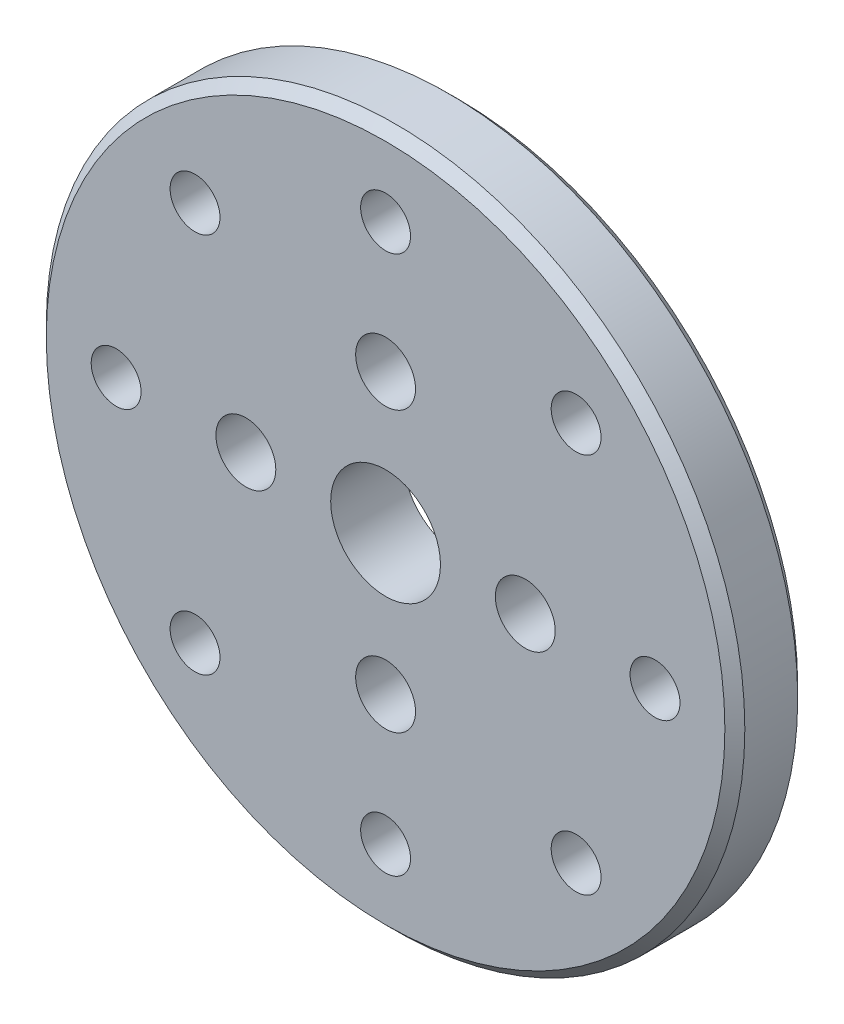
ISO-10303-21;
HEADER;
FILE_DESCRIPTION(('STEP AP214'),'2;1');
FILE_NAME('part.step','',(''),(''),'','','');
FILE_SCHEMA(('AUTOMOTIVE_DESIGN { 1 0 10303 214 1 1 1 1 }'));
ENDSEC;
DATA;
#1=APPLICATION_CONTEXT('core data for automotive mechanical design processes');
#2=APPLICATION_PROTOCOL_DEFINITION('international standard','automotive_design',2000,#1);
#3=PRODUCT_CONTEXT('',#1,'mechanical');
#4=PRODUCT('Part','Part','',(#3));
#5=PRODUCT_RELATED_PRODUCT_CATEGORY('part','',(#4));
#6=PRODUCT_DEFINITION_FORMATION('','',#4);
#7=PRODUCT_DEFINITION_CONTEXT('part definition',#1,'design');
#8=PRODUCT_DEFINITION('design','',#6,#7);
#9=PRODUCT_DEFINITION_SHAPE('','',#8);
#10=(LENGTH_UNIT() NAMED_UNIT(*) SI_UNIT(.MILLI.,.METRE.));
#11=(NAMED_UNIT(*) PLANE_ANGLE_UNIT() SI_UNIT($,.RADIAN.));
#12=(NAMED_UNIT(*) SI_UNIT($,.STERADIAN.) SOLID_ANGLE_UNIT());
#13=UNCERTAINTY_MEASURE_WITH_UNIT(LENGTH_MEASURE(1.E-05),#10,'distance_accuracy_value','');
#14=(GEOMETRIC_REPRESENTATION_CONTEXT(3) GLOBAL_UNCERTAINTY_ASSIGNED_CONTEXT((#13)) GLOBAL_UNIT_ASSIGNED_CONTEXT((#10,
#11,#12)) REPRESENTATION_CONTEXT('',''));
#15=CARTESIAN_POINT('',(0.,0.,0.));
#16=DIRECTION('',(0.,0.,1.));
#17=DIRECTION('',(1.,0.,0.));
#18=AXIS2_PLACEMENT_3D('',#15,#16,#17);
#19=CARTESIAN_POINT('',(0.,0.,3.65));
#20=DIRECTION('',(0.,0.,-1.));
#21=DIRECTION('',(-1.,0.,0.));
#22=AXIS2_PLACEMENT_3D('',#19,#20,#21);
#23=CYLINDRICAL_SURFACE('',#22,17.5);
#24=CARTESIAN_POINT('',(0.,0.,0.500000000000007));
#25=DIRECTION('',(0.,0.,1.));
#26=DIRECTION('',(1.,0.,0.));
#27=AXIS2_PLACEMENT_3D('',#24,#25,#26);
#28=CIRCLE('',#27,17.5);
#29=CARTESIAN_POINT('',(17.5,0.,0.500000000000007));
#30=VERTEX_POINT('',#29);
#31=EDGE_CURVE('E57',#30,#30,#28,.T.);
#32=ORIENTED_EDGE('',*,*,#31,.T.);
#33=EDGE_LOOP('',(#32));
#34=FACE_BOUND('',#33,.T.);
#35=CARTESIAN_POINT('',(0.,0.,3.15));
#36=DIRECTION('',(0.,0.,1.));
#37=DIRECTION('',(1.,0.,0.));
#38=AXIS2_PLACEMENT_3D('',#35,#36,#37);
#39=CIRCLE('',#38,17.5);
#40=CARTESIAN_POINT('',(17.5,0.,3.15));
#41=VERTEX_POINT('',#40);
#42=EDGE_CURVE('E63',#41,#41,#39,.F.);
#43=ORIENTED_EDGE('',*,*,#42,.T.);
#44=EDGE_LOOP('',(#43));
#45=FACE_BOUND('',#44,.T.);
#46=ADVANCED_FACE('F42',(#34,#45),#23,.T.);
#47=CARTESIAN_POINT('',(0.,0.,3.65));
#48=DIRECTION('',(0.,0.,1.));
#49=DIRECTION('',(1.,0.,0.));
#50=AXIS2_PLACEMENT_3D('',#47,#48,#49);
#51=PLANE('',#50);
#52=CARTESIAN_POINT('',(0.,0.,3.65));
#53=DIRECTION('',(0.,0.,1.));
#54=DIRECTION('',(1.,0.,0.));
#55=AXIS2_PLACEMENT_3D('',#52,#53,#54);
#56=CIRCLE('',#55,2.75);
#57=CARTESIAN_POINT('',(2.75,0.,3.65));
#58=VERTEX_POINT('',#57);
#59=EDGE_CURVE('E155',#58,#58,#56,.T.);
#60=ORIENTED_EDGE('',*,*,#59,.F.);
#61=EDGE_LOOP('',(#60));
#62=FACE_BOUND('',#61,.T.);
#63=CARTESIAN_POINT('',(0.,7.,3.65));
#64=DIRECTION('',(0.,0.,1.));
#65=DIRECTION('',(1.,0.,0.));
#66=AXIS2_PLACEMENT_3D('',#63,#64,#65);
#67=CIRCLE('',#66,1.5);
#68=CARTESIAN_POINT('',(1.5,7.,3.65));
#69=VERTEX_POINT('',#68);
#70=EDGE_CURVE('E107',#69,#69,#67,.T.);
#71=ORIENTED_EDGE('',*,*,#70,.F.);
#72=EDGE_LOOP('',(#71));
#73=FACE_BOUND('',#72,.T.);
#74=CARTESIAN_POINT('',(-7.0000000000002,1.97666086873723E-13,3.65));
#75=DIRECTION('',(0.,0.,1.));
#76=DIRECTION('',(1.,0.,0.));
#77=AXIS2_PLACEMENT_3D('',#74,#75,#76);
#78=CIRCLE('',#77,1.50000000000015);
#79=CARTESIAN_POINT('',(-5.50000000000004,1.97666086873723E-13,3.65));
#80=VERTEX_POINT('',#79);
#81=EDGE_CURVE('E137',#80,#80,#78,.T.);
#82=ORIENTED_EDGE('',*,*,#81,.F.);
#83=EDGE_LOOP('',(#82));
#84=FACE_BOUND('',#83,.T.);
#85=CARTESIAN_POINT('',(-3.95332173747447E-13,-7.,3.65));
#86=DIRECTION('',(0.,0.,1.));
#87=DIRECTION('',(1.,0.,0.));
#88=AXIS2_PLACEMENT_3D('',#85,#86,#87);
#89=CIRCLE('',#88,1.50000000000042);
#90=CARTESIAN_POINT('',(1.50000000000003,-7.,3.65));
#91=VERTEX_POINT('',#90);
#92=EDGE_CURVE('E141',#91,#91,#89,.T.);
#93=ORIENTED_EDGE('',*,*,#92,.F.);
#94=EDGE_LOOP('',(#93));
#95=FACE_BOUND('',#94,.T.);
#96=CARTESIAN_POINT('',(6.9999999999998,-1.98523339633126E-13,3.65));
#97=DIRECTION('',(0.,0.,1.));
#98=DIRECTION('',(1.,0.,0.));
#99=AXIS2_PLACEMENT_3D('',#96,#97,#98);
#100=CIRCLE('',#99,1.50000000000032);
#101=CARTESIAN_POINT('',(8.50000000000012,-1.98523339633126E-13,3.65));
#102=VERTEX_POINT('',#101);
#103=EDGE_CURVE('E145',#102,#102,#100,.T.);
#104=ORIENTED_EDGE('',*,*,#103,.F.);
#105=EDGE_LOOP('',(#104));
#106=FACE_BOUND('',#105,.T.);
#107=CARTESIAN_POINT('',(0.,0.,3.65));
#108=DIRECTION('',(0.,0.,1.));
#109=DIRECTION('',(1.,0.,0.));
#110=AXIS2_PLACEMENT_3D('',#107,#108,#109);
#111=CIRCLE('',#110,17.);
#112=CARTESIAN_POINT('',(17.,0.,3.65));
#113=VERTEX_POINT('',#112);
#114=EDGE_CURVE('E10',#113,#113,#111,.T.);
#115=ORIENTED_EDGE('',*,*,#114,.T.);
#116=EDGE_LOOP('',(#115));
#117=FACE_BOUND('',#116,.T.);
#118=CARTESIAN_POINT('',(0.,13.5,3.65));
#119=DIRECTION('',(0.,0.,1.));
#120=DIRECTION('',(1.,0.,0.));
#121=AXIS2_PLACEMENT_3D('',#118,#119,#120);
#122=CIRCLE('',#121,1.25);
#123=CARTESIAN_POINT('',(1.25,13.5,3.65));
#124=VERTEX_POINT('',#123);
#125=EDGE_CURVE('E69',#124,#124,#122,.T.);
#126=ORIENTED_EDGE('',*,*,#125,.F.);
#127=EDGE_LOOP('',(#126));
#128=FACE_BOUND('',#127,.T.);
#129=CARTESIAN_POINT('',(-9.54594154601854,9.54594154601875,3.65));
#130=DIRECTION('',(0.,0.,1.));
#131=DIRECTION('',(1.,0.,0.));
#132=AXIS2_PLACEMENT_3D('',#129,#130,#131);
#133=CIRCLE('',#132,1.25);
#134=CARTESIAN_POINT('',(-8.29594154601854,9.54594154601875,3.65));
#135=VERTEX_POINT('',#134);
#136=EDGE_CURVE('E73',#135,#135,#133,.T.);
#137=ORIENTED_EDGE('',*,*,#136,.F.);
#138=EDGE_LOOP('',(#137));
#139=FACE_BOUND('',#138,.T.);
#140=CARTESIAN_POINT('',(-13.5000000000005,5.09478254018743E-13,3.65));
#141=DIRECTION('',(0.,0.,1.));
#142=DIRECTION('',(1.,0.,0.));
#143=AXIS2_PLACEMENT_3D('',#140,#141,#142);
#144=CIRCLE('',#143,1.25);
#145=CARTESIAN_POINT('',(-12.2500000000005,5.09478254018743E-13,3.65));
#146=VERTEX_POINT('',#145);
#147=EDGE_CURVE('E77',#146,#146,#144,.T.);
#148=ORIENTED_EDGE('',*,*,#147,.F.);
#149=EDGE_LOOP('',(#148));
#150=FACE_BOUND('',#149,.T.);
#151=CARTESIAN_POINT('',(-9.54594154601926,-9.54594154601803,3.65));
#152=DIRECTION('',(0.,0.,1.));
#153=DIRECTION('',(1.,0.,0.));
#154=AXIS2_PLACEMENT_3D('',#151,#152,#153);
#155=CIRCLE('',#154,1.25);
#156=CARTESIAN_POINT('',(-8.29594154601926,-9.54594154601803,3.65));
#157=VERTEX_POINT('',#156);
#158=EDGE_CURVE('E81',#157,#157,#155,.T.);
#159=ORIENTED_EDGE('',*,*,#158,.F.);
#160=EDGE_LOOP('',(#159));
#161=FACE_BOUND('',#160,.T.);
#162=CARTESIAN_POINT('',(-1.01895650803749E-12,-13.5,3.65));
#163=DIRECTION('',(0.,0.,1.));
#164=DIRECTION('',(1.,0.,0.));
#165=AXIS2_PLACEMENT_3D('',#162,#163,#164);
#166=CIRCLE('',#165,1.25);
#167=CARTESIAN_POINT('',(1.24999999999898,-13.5,3.65));
#168=VERTEX_POINT('',#167);
#169=EDGE_CURVE('E85',#168,#168,#166,.T.);
#170=ORIENTED_EDGE('',*,*,#169,.F.);
#171=EDGE_LOOP('',(#170));
#172=FACE_BOUND('',#171,.T.);
#173=CARTESIAN_POINT('',(9.54594154601752,-9.54594154601875,3.65));
#174=DIRECTION('',(0.,0.,1.));
#175=DIRECTION('',(1.,0.,0.));
#176=AXIS2_PLACEMENT_3D('',#173,#174,#175);
#177=CIRCLE('',#176,1.25);
#178=CARTESIAN_POINT('',(10.7959415460175,-9.54594154601875,3.65));
#179=VERTEX_POINT('',#178);
#180=EDGE_CURVE('E89',#179,#179,#177,.T.);
#181=ORIENTED_EDGE('',*,*,#180,.F.);
#182=EDGE_LOOP('',(#181));
#183=FACE_BOUND('',#182,.T.);
#184=CARTESIAN_POINT('',(13.4999999999995,-5.11131527197592E-13,3.65));
#185=DIRECTION('',(0.,0.,1.));
#186=DIRECTION('',(1.,0.,0.));
#187=AXIS2_PLACEMENT_3D('',#184,#185,#186);
#188=CIRCLE('',#187,1.25);
#189=CARTESIAN_POINT('',(14.7499999999995,-5.11131527197592E-13,3.65));
#190=VERTEX_POINT('',#189);
#191=EDGE_CURVE('E93',#190,#190,#188,.T.);
#192=ORIENTED_EDGE('',*,*,#191,.F.);
#193=EDGE_LOOP('',(#192));
#194=FACE_BOUND('',#193,.T.);
#195=CARTESIAN_POINT('',(9.54594154601824,9.54594154601803,3.65));
#196=DIRECTION('',(0.,0.,1.));
#197=DIRECTION('',(1.,0.,0.));
#198=AXIS2_PLACEMENT_3D('',#195,#196,#197);
#199=CIRCLE('',#198,1.25);
#200=CARTESIAN_POINT('',(10.7959415460182,9.54594154601803,3.65));
#201=VERTEX_POINT('',#200);
#202=EDGE_CURVE('E97',#201,#201,#199,.T.);
#203=ORIENTED_EDGE('',*,*,#202,.F.);
#204=EDGE_LOOP('',(#203));
#205=FACE_BOUND('',#204,.T.);
#206=ADVANCED_FACE('F181',(#62,#73,#84,#95,#106,#117,#128,#139,#150,#161,#172,#183,#194,#205),
#51,.T.);
#207=CARTESIAN_POINT('',(0.,0.,0.));
#208=DIRECTION('',(0.,0.,1.));
#209=DIRECTION('',(1.,0.,0.));
#210=AXIS2_PLACEMENT_3D('',#207,#208,#209);
#211=PLANE('',#210);
#212=CARTESIAN_POINT('',(0.,0.,0.));
#213=DIRECTION('',(0.,0.,-1.));
#214=DIRECTION('',(-1.,0.,0.));
#215=AXIS2_PLACEMENT_3D('',#212,#213,#214);
#216=CIRCLE('',#215,2.75);
#217=CARTESIAN_POINT('',(-2.75,0.,0.));
#218=VERTEX_POINT('',#217);
#219=EDGE_CURVE('E169',#218,#218,#216,.T.);
#220=ORIENTED_EDGE('',*,*,#219,.F.);
#221=EDGE_LOOP('',(#220));
#222=FACE_BOUND('',#221,.T.);
#223=CARTESIAN_POINT('',(0.,7.,0.));
#224=DIRECTION('',(0.,0.,-1.));
#225=DIRECTION('',(-1.,0.,0.));
#226=AXIS2_PLACEMENT_3D('',#223,#224,#225);
#227=CIRCLE('',#226,1.5);
#228=CARTESIAN_POINT('',(-1.5,7.,0.));
#229=VERTEX_POINT('',#228);
#230=EDGE_CURVE('E149',#229,#229,#227,.T.);
#231=ORIENTED_EDGE('',*,*,#230,.F.);
#232=EDGE_LOOP('',(#231));
#233=FACE_BOUND('',#232,.T.);
#234=CARTESIAN_POINT('',(-7.0000000000002,1.97666086873723E-13,0.));
#235=DIRECTION('',(0.,0.,-1.));
#236=DIRECTION('',(-1.,0.,0.));
#237=AXIS2_PLACEMENT_3D('',#234,#235,#236);
#238=CIRCLE('',#237,1.50000000000015);
#239=CARTESIAN_POINT('',(-8.50000000000035,1.97666086873723E-13,0.));
#240=VERTEX_POINT('',#239);
#241=EDGE_CURVE('E159',#240,#240,#238,.T.);
#242=ORIENTED_EDGE('',*,*,#241,.F.);
#243=EDGE_LOOP('',(#242));
#244=FACE_BOUND('',#243,.T.);
#245=CARTESIAN_POINT('',(-3.95332173747447E-13,-7.,0.));
#246=DIRECTION('',(0.,0.,-1.));
#247=DIRECTION('',(-1.,0.,0.));
#248=AXIS2_PLACEMENT_3D('',#245,#246,#247);
#249=CIRCLE('',#248,1.50000000000042);
#250=CARTESIAN_POINT('',(-1.50000000000082,-7.,0.));
#251=VERTEX_POINT('',#250);
#252=EDGE_CURVE('E154',#251,#251,#249,.T.);
#253=ORIENTED_EDGE('',*,*,#252,.F.);
#254=EDGE_LOOP('',(#253));
#255=FACE_BOUND('',#254,.T.);
#256=CARTESIAN_POINT('',(6.9999999999998,-1.98523339633126E-13,0.));
#257=DIRECTION('',(0.,0.,-1.));
#258=DIRECTION('',(-1.,0.,0.));
#259=AXIS2_PLACEMENT_3D('',#256,#257,#258);
#260=CIRCLE('',#259,1.50000000000032);
#261=CARTESIAN_POINT('',(5.49999999999949,-1.98523339633126E-13,0.));
#262=VERTEX_POINT('',#261);
#263=EDGE_CURVE('E150',#262,#262,#260,.T.);
#264=ORIENTED_EDGE('',*,*,#263,.F.);
#265=EDGE_LOOP('',(#264));
#266=FACE_BOUND('',#265,.T.);
#267=CARTESIAN_POINT('',(0.,0.,0.));
#268=DIRECTION('',(0.,0.,1.));
#269=DIRECTION('',(1.,0.,0.));
#270=AXIS2_PLACEMENT_3D('',#267,#268,#269);
#271=CIRCLE('',#270,17.);
#272=CARTESIAN_POINT('',(17.,0.,0.));
#273=VERTEX_POINT('',#272);
#274=EDGE_CURVE('E51',#273,#273,#271,.F.);
#275=ORIENTED_EDGE('',*,*,#274,.T.);
#276=EDGE_LOOP('',(#275));
#277=FACE_BOUND('',#276,.T.);
#278=CARTESIAN_POINT('',(0.,13.5,0.));
#279=DIRECTION('',(0.,0.,-1.));
#280=DIRECTION('',(-1.,0.,0.));
#281=AXIS2_PLACEMENT_3D('',#278,#279,#280);
#282=CIRCLE('',#281,1.25);
#283=CARTESIAN_POINT('',(-1.25,13.5,0.));
#284=VERTEX_POINT('',#283);
#285=EDGE_CURVE('E101',#284,#284,#282,.T.);
#286=ORIENTED_EDGE('',*,*,#285,.F.);
#287=EDGE_LOOP('',(#286));
#288=FACE_BOUND('',#287,.T.);
#289=CARTESIAN_POINT('',(-9.54594154601854,9.54594154601875,0.));
#290=DIRECTION('',(0.,0.,-1.));
#291=DIRECTION('',(-1.,0.,0.));
#292=AXIS2_PLACEMENT_3D('',#289,#290,#291);
#293=CIRCLE('',#292,1.25);
#294=CARTESIAN_POINT('',(-10.7959415460185,9.54594154601875,0.));
#295=VERTEX_POINT('',#294);
#296=EDGE_CURVE('E127',#295,#295,#293,.T.);
#297=ORIENTED_EDGE('',*,*,#296,.F.);
#298=EDGE_LOOP('',(#297));
#299=FACE_BOUND('',#298,.T.);
#300=CARTESIAN_POINT('',(-13.5000000000005,5.09478254018743E-13,0.));
#301=DIRECTION('',(0.,0.,-1.));
#302=DIRECTION('',(-1.,0.,0.));
#303=AXIS2_PLACEMENT_3D('',#300,#301,#302);
#304=CIRCLE('',#303,1.25);
#305=CARTESIAN_POINT('',(-14.7500000000005,5.09478254018743E-13,0.));
#306=VERTEX_POINT('',#305);
#307=EDGE_CURVE('E123',#306,#306,#304,.T.);
#308=ORIENTED_EDGE('',*,*,#307,.F.);
#309=EDGE_LOOP('',(#308));
#310=FACE_BOUND('',#309,.T.);
#311=CARTESIAN_POINT('',(-9.54594154601926,-9.54594154601803,0.));
#312=DIRECTION('',(0.,0.,-1.));
#313=DIRECTION('',(-1.,0.,0.));
#314=AXIS2_PLACEMENT_3D('',#311,#312,#313);
#315=CIRCLE('',#314,1.25);
#316=CARTESIAN_POINT('',(-10.7959415460193,-9.54594154601803,0.));
#317=VERTEX_POINT('',#316);
#318=EDGE_CURVE('E119',#317,#317,#315,.T.);
#319=ORIENTED_EDGE('',*,*,#318,.F.);
#320=EDGE_LOOP('',(#319));
#321=FACE_BOUND('',#320,.T.);
#322=CARTESIAN_POINT('',(-1.01895650803749E-12,-13.5,0.));
#323=DIRECTION('',(0.,0.,-1.));
#324=DIRECTION('',(-1.,0.,0.));
#325=AXIS2_PLACEMENT_3D('',#322,#323,#324);
#326=CIRCLE('',#325,1.25);
#327=CARTESIAN_POINT('',(-1.25000000000102,-13.5,0.));
#328=VERTEX_POINT('',#327);
#329=EDGE_CURVE('E115',#328,#328,#326,.T.);
#330=ORIENTED_EDGE('',*,*,#329,.F.);
#331=EDGE_LOOP('',(#330));
#332=FACE_BOUND('',#331,.T.);
#333=CARTESIAN_POINT('',(9.54594154601752,-9.54594154601875,0.));
#334=DIRECTION('',(0.,0.,-1.));
#335=DIRECTION('',(-1.,0.,0.));
#336=AXIS2_PLACEMENT_3D('',#333,#334,#335);
#337=CIRCLE('',#336,1.25);
#338=CARTESIAN_POINT('',(8.29594154601752,-9.54594154601875,0.));
#339=VERTEX_POINT('',#338);
#340=EDGE_CURVE('E111',#339,#339,#337,.T.);
#341=ORIENTED_EDGE('',*,*,#340,.F.);
#342=EDGE_LOOP('',(#341));
#343=FACE_BOUND('',#342,.T.);
#344=CARTESIAN_POINT('',(13.4999999999995,-5.11131527197592E-13,0.));
#345=DIRECTION('',(0.,0.,-1.));
#346=DIRECTION('',(-1.,0.,0.));
#347=AXIS2_PLACEMENT_3D('',#344,#345,#346);
#348=CIRCLE('',#347,1.25);
#349=CARTESIAN_POINT('',(12.2499999999995,-5.11131527197592E-13,0.));
#350=VERTEX_POINT('',#349);
#351=EDGE_CURVE('E106',#350,#350,#348,.T.);
#352=ORIENTED_EDGE('',*,*,#351,.F.);
#353=EDGE_LOOP('',(#352));
#354=FACE_BOUND('',#353,.T.);
#355=CARTESIAN_POINT('',(9.54594154601824,9.54594154601803,0.));
#356=DIRECTION('',(0.,0.,-1.));
#357=DIRECTION('',(-1.,0.,0.));
#358=AXIS2_PLACEMENT_3D('',#355,#356,#357);
#359=CIRCLE('',#358,1.25);
#360=CARTESIAN_POINT('',(8.29594154601824,9.54594154601803,0.));
#361=VERTEX_POINT('',#360);
#362=EDGE_CURVE('E102',#361,#361,#359,.T.);
#363=ORIENTED_EDGE('',*,*,#362,.F.);
#364=EDGE_LOOP('',(#363));
#365=FACE_BOUND('',#364,.T.);
#366=ADVANCED_FACE('F177',(#222,#233,#244,#255,#266,#277,#288,#299,#310,#321,#332,#343,#354,
#365),#211,.F.);
#367=CARTESIAN_POINT('',(9.54594154601824,9.54594154601803,5.));
#368=DIRECTION('',(0.,0.,-1.));
#369=DIRECTION('',(-1.,0.,0.));
#370=AXIS2_PLACEMENT_3D('',#367,#368,#369);
#371=CYLINDRICAL_SURFACE('',#370,1.25);
#372=ORIENTED_EDGE('',*,*,#202,.T.);
#373=EDGE_LOOP('',(#372));
#374=FACE_BOUND('',#373,.T.);
#375=ORIENTED_EDGE('',*,*,#362,.T.);
#376=EDGE_LOOP('',(#375));
#377=FACE_BOUND('',#376,.T.);
#378=ADVANCED_FACE('F180',(#374,#377),#371,.F.);
#379=CARTESIAN_POINT('',(13.4999999999995,-5.11131527197592E-13,5.));
#380=DIRECTION('',(0.,0.,-1.));
#381=DIRECTION('',(-1.,0.,0.));
#382=AXIS2_PLACEMENT_3D('',#379,#380,#381);
#383=CYLINDRICAL_SURFACE('',#382,1.25);
#384=ORIENTED_EDGE('',*,*,#191,.T.);
#385=EDGE_LOOP('',(#384));
#386=FACE_BOUND('',#385,.T.);
#387=ORIENTED_EDGE('',*,*,#351,.T.);
#388=EDGE_LOOP('',(#387));
#389=FACE_BOUND('',#388,.T.);
#390=ADVANCED_FACE('F208',(#386,#389),#383,.F.);
#391=CARTESIAN_POINT('',(9.54594154601752,-9.54594154601875,5.));
#392=DIRECTION('',(0.,0.,-1.));
#393=DIRECTION('',(-1.,0.,0.));
#394=AXIS2_PLACEMENT_3D('',#391,#392,#393);
#395=CYLINDRICAL_SURFACE('',#394,1.25);
#396=ORIENTED_EDGE('',*,*,#180,.T.);
#397=EDGE_LOOP('',(#396));
#398=FACE_BOUND('',#397,.T.);
#399=ORIENTED_EDGE('',*,*,#340,.T.);
#400=EDGE_LOOP('',(#399));
#401=FACE_BOUND('',#400,.T.);
#402=ADVANCED_FACE('F214',(#398,#401),#395,.F.);
#403=CARTESIAN_POINT('',(-1.01895650803749E-12,-13.5,5.));
#404=DIRECTION('',(0.,0.,-1.));
#405=DIRECTION('',(-1.,0.,0.));
#406=AXIS2_PLACEMENT_3D('',#403,#404,#405);
#407=CYLINDRICAL_SURFACE('',#406,1.25);
#408=ORIENTED_EDGE('',*,*,#169,.T.);
#409=EDGE_LOOP('',(#408));
#410=FACE_BOUND('',#409,.T.);
#411=ORIENTED_EDGE('',*,*,#329,.T.);
#412=EDGE_LOOP('',(#411));
#413=FACE_BOUND('',#412,.T.);
#414=ADVANCED_FACE('F260',(#410,#413),#407,.F.);
#415=CARTESIAN_POINT('',(-9.54594154601926,-9.54594154601803,5.));
#416=DIRECTION('',(0.,0.,-1.));
#417=DIRECTION('',(-1.,0.,0.));
#418=AXIS2_PLACEMENT_3D('',#415,#416,#417);
#419=CYLINDRICAL_SURFACE('',#418,1.25);
#420=ORIENTED_EDGE('',*,*,#158,.T.);
#421=EDGE_LOOP('',(#420));
#422=FACE_BOUND('',#421,.T.);
#423=ORIENTED_EDGE('',*,*,#318,.T.);
#424=EDGE_LOOP('',(#423));
#425=FACE_BOUND('',#424,.T.);
#426=ADVANCED_FACE('F256',(#422,#425),#419,.F.);
#427=CARTESIAN_POINT('',(-13.5000000000005,5.09478254018743E-13,5.));
#428=DIRECTION('',(0.,0.,-1.));
#429=DIRECTION('',(-1.,0.,0.));
#430=AXIS2_PLACEMENT_3D('',#427,#428,#429);
#431=CYLINDRICAL_SURFACE('',#430,1.25);
#432=ORIENTED_EDGE('',*,*,#147,.T.);
#433=EDGE_LOOP('',(#432));
#434=FACE_BOUND('',#433,.T.);
#435=ORIENTED_EDGE('',*,*,#307,.T.);
#436=EDGE_LOOP('',(#435));
#437=FACE_BOUND('',#436,.T.);
#438=ADVANCED_FACE('F247',(#434,#437),#431,.F.);
#439=CARTESIAN_POINT('',(-9.54594154601854,9.54594154601875,5.));
#440=DIRECTION('',(0.,0.,-1.));
#441=DIRECTION('',(-1.,0.,0.));
#442=AXIS2_PLACEMENT_3D('',#439,#440,#441);
#443=CYLINDRICAL_SURFACE('',#442,1.25);
#444=ORIENTED_EDGE('',*,*,#136,.T.);
#445=EDGE_LOOP('',(#444));
#446=FACE_BOUND('',#445,.T.);
#447=ORIENTED_EDGE('',*,*,#296,.T.);
#448=EDGE_LOOP('',(#447));
#449=FACE_BOUND('',#448,.T.);
#450=ADVANCED_FACE('F239',(#446,#449),#443,.F.);
#451=CARTESIAN_POINT('',(0.,13.5,5.));
#452=DIRECTION('',(0.,0.,-1.));
#453=DIRECTION('',(-1.,0.,0.));
#454=AXIS2_PLACEMENT_3D('',#451,#452,#453);
#455=CYLINDRICAL_SURFACE('',#454,1.25);
#456=ORIENTED_EDGE('',*,*,#125,.T.);
#457=EDGE_LOOP('',(#456));
#458=FACE_BOUND('',#457,.T.);
#459=ORIENTED_EDGE('',*,*,#285,.T.);
#460=EDGE_LOOP('',(#459));
#461=FACE_BOUND('',#460,.T.);
#462=ADVANCED_FACE('F231',(#458,#461),#455,.F.);
#463=CARTESIAN_POINT('',(0.,0.,0.500000000000007));
#464=DIRECTION('',(0.,0.,1.));
#465=DIRECTION('',(1.,0.,0.));
#466=AXIS2_PLACEMENT_3D('',#463,#464,#465);
#467=CONICAL_SURFACE('',#466,17.5,0.785398163397445);
#468=ORIENTED_EDGE('',*,*,#274,.F.);
#469=EDGE_LOOP('',(#468));
#470=FACE_BOUND('',#469,.T.);
#471=ORIENTED_EDGE('',*,*,#31,.F.);
#472=EDGE_LOOP('',(#471));
#473=FACE_BOUND('',#472,.T.);
#474=ADVANCED_FACE('F227',(#470,#473),#467,.T.);
#475=CARTESIAN_POINT('',(0.,0.,3.65));
#476=DIRECTION('',(0.,0.,-1.));
#477=DIRECTION('',(-1.,0.,0.));
#478=AXIS2_PLACEMENT_3D('',#475,#476,#477);
#479=CONICAL_SURFACE('',#478,17.,0.785398163397441);
#480=ORIENTED_EDGE('',*,*,#42,.F.);
#481=EDGE_LOOP('',(#480));
#482=FACE_BOUND('',#481,.T.);
#483=ORIENTED_EDGE('',*,*,#114,.F.);
#484=EDGE_LOOP('',(#483));
#485=FACE_BOUND('',#484,.T.);
#486=ADVANCED_FACE('F45',(#482,#485),#479,.T.);
#487=CARTESIAN_POINT('',(6.9999999999998,-1.98523339633126E-13,10.));
#488=DIRECTION('',(0.,0.,-1.));
#489=DIRECTION('',(-1.,0.,0.));
#490=AXIS2_PLACEMENT_3D('',#487,#488,#489);
#491=CYLINDRICAL_SURFACE('',#490,1.50000000000032);
#492=ORIENTED_EDGE('',*,*,#103,.T.);
#493=EDGE_LOOP('',(#492));
#494=FACE_BOUND('',#493,.T.);
#495=ORIENTED_EDGE('',*,*,#263,.T.);
#496=EDGE_LOOP('',(#495));
#497=FACE_BOUND('',#496,.T.);
#498=ADVANCED_FACE('F237',(#494,#497),#491,.F.);
#499=CARTESIAN_POINT('',(-3.95332173747447E-13,-7.,10.));
#500=DIRECTION('',(0.,0.,-1.));
#501=DIRECTION('',(-1.,0.,0.));
#502=AXIS2_PLACEMENT_3D('',#499,#500,#501);
#503=CYLINDRICAL_SURFACE('',#502,1.50000000000042);
#504=ORIENTED_EDGE('',*,*,#92,.T.);
#505=EDGE_LOOP('',(#504));
#506=FACE_BOUND('',#505,.T.);
#507=ORIENTED_EDGE('',*,*,#252,.T.);
#508=EDGE_LOOP('',(#507));
#509=FACE_BOUND('',#508,.T.);
#510=ADVANCED_FACE('F328',(#506,#509),#503,.F.);
#511=CARTESIAN_POINT('',(-7.0000000000002,1.97666086873723E-13,10.));
#512=DIRECTION('',(0.,0.,-1.));
#513=DIRECTION('',(-1.,0.,0.));
#514=AXIS2_PLACEMENT_3D('',#511,#512,#513);
#515=CYLINDRICAL_SURFACE('',#514,1.50000000000015);
#516=ORIENTED_EDGE('',*,*,#81,.T.);
#517=EDGE_LOOP('',(#516));
#518=FACE_BOUND('',#517,.T.);
#519=ORIENTED_EDGE('',*,*,#241,.T.);
#520=EDGE_LOOP('',(#519));
#521=FACE_BOUND('',#520,.T.);
#522=ADVANCED_FACE('F338',(#518,#521),#515,.F.);
#523=CARTESIAN_POINT('',(0.,7.,10.));
#524=DIRECTION('',(0.,0.,-1.));
#525=DIRECTION('',(-1.,0.,0.));
#526=AXIS2_PLACEMENT_3D('',#523,#524,#525);
#527=CYLINDRICAL_SURFACE('',#526,1.5);
#528=ORIENTED_EDGE('',*,*,#70,.T.);
#529=EDGE_LOOP('',(#528));
#530=FACE_BOUND('',#529,.T.);
#531=ORIENTED_EDGE('',*,*,#230,.T.);
#532=EDGE_LOOP('',(#531));
#533=FACE_BOUND('',#532,.T.);
#534=ADVANCED_FACE('F348',(#530,#533),#527,.F.);
#535=CARTESIAN_POINT('',(0.,0.,10.));
#536=DIRECTION('',(0.,0.,-1.));
#537=DIRECTION('',(-1.,0.,0.));
#538=AXIS2_PLACEMENT_3D('',#535,#536,#537);
#539=CYLINDRICAL_SURFACE('',#538,2.75);
#540=ORIENTED_EDGE('',*,*,#59,.T.);
#541=EDGE_LOOP('',(#540));
#542=FACE_BOUND('',#541,.T.);
#543=ORIENTED_EDGE('',*,*,#219,.T.);
#544=EDGE_LOOP('',(#543));
#545=FACE_BOUND('',#544,.T.);
#546=ADVANCED_FACE('F175',(#542,#545),#539,.F.);
#547=CLOSED_SHELL('',(#46,#206,#366,#378,#390,#402,#414,#426,#438,#450,#462,#474,#486,#498,#510,
#522,#534,#546));
#548=MANIFOLD_SOLID_BREP('B2',#547);
#549=ADVANCED_BREP_SHAPE_REPRESENTATION('',(#18,#548),#14);
#550=SHAPE_DEFINITION_REPRESENTATION(#9,#549);
ENDSEC;
END-ISO-10303-21;
